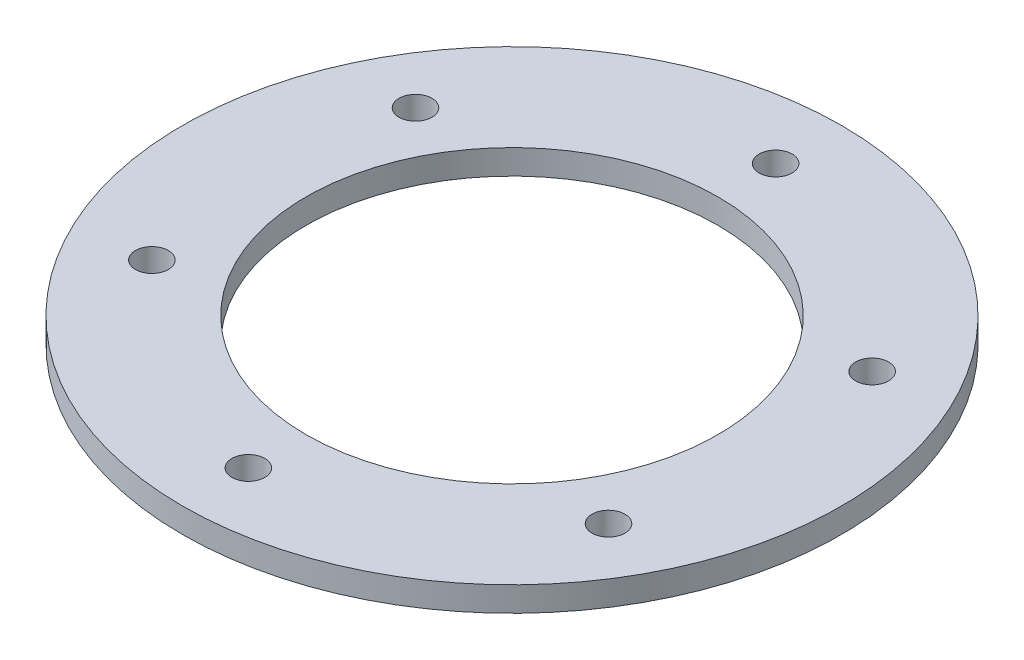
ISO-10303-21;
HEADER;
FILE_DESCRIPTION(('STEP AP214'),'2;1');
FILE_NAME('part.step','',(''),(''),'','','');
FILE_SCHEMA(('AUTOMOTIVE_DESIGN { 1 0 10303 214 1 1 1 1 }'));
ENDSEC;
DATA;
#1=APPLICATION_CONTEXT('core data for automotive mechanical design processes');
#2=APPLICATION_PROTOCOL_DEFINITION('international standard','automotive_design',2000,#1);
#3=PRODUCT_CONTEXT('',#1,'mechanical');
#4=PRODUCT('Part','Part','',(#3));
#5=PRODUCT_RELATED_PRODUCT_CATEGORY('part','',(#4));
#6=PRODUCT_DEFINITION_FORMATION('','',#4);
#7=PRODUCT_DEFINITION_CONTEXT('part definition',#1,'design');
#8=PRODUCT_DEFINITION('design','',#6,#7);
#9=PRODUCT_DEFINITION_SHAPE('','',#8);
#10=(LENGTH_UNIT() NAMED_UNIT(*) SI_UNIT(.MILLI.,.METRE.));
#11=(NAMED_UNIT(*) PLANE_ANGLE_UNIT() SI_UNIT($,.RADIAN.));
#12=(NAMED_UNIT(*) SI_UNIT($,.STERADIAN.) SOLID_ANGLE_UNIT());
#13=UNCERTAINTY_MEASURE_WITH_UNIT(LENGTH_MEASURE(1.E-05),#10,'distance_accuracy_value','');
#14=(GEOMETRIC_REPRESENTATION_CONTEXT(3) GLOBAL_UNCERTAINTY_ASSIGNED_CONTEXT((#13)) GLOBAL_UNIT_ASSIGNED_CONTEXT((#10,
#11,#12)) REPRESENTATION_CONTEXT('',''));
#15=CARTESIAN_POINT('',(0.,0.,0.));
#16=DIRECTION('',(0.,0.,1.));
#17=DIRECTION('',(1.,0.,0.));
#18=AXIS2_PLACEMENT_3D('',#15,#16,#17);
#19=CARTESIAN_POINT('',(0.,15.,0.));
#20=DIRECTION('',(0.,1.,0.));
#21=DIRECTION('',(0.,0.,1.));
#22=AXIS2_PLACEMENT_3D('',#19,#20,#21);
#23=PLANE('',#22);
#24=CARTESIAN_POINT('',(-138.56406460551,15.,80.0000000000001));
#25=DIRECTION('',(0.,1.,0.));
#26=DIRECTION('',(0.,0.,1.));
#27=AXIS2_PLACEMENT_3D('',#24,#25,#26);
#28=CIRCLE('',#27,10.);
#29=CARTESIAN_POINT('',(-138.56406460551,15.,90.0000000000001));
#30=VERTEX_POINT('',#29);
#31=EDGE_CURVE('E72',#30,#30,#28,.T.);
#32=ORIENTED_EDGE('',*,*,#31,.F.);
#33=EDGE_LOOP('',(#32));
#34=FACE_BOUND('',#33,.T.);
#35=CARTESIAN_POINT('',(138.56406460551,15.,80.));
#36=DIRECTION('',(0.,1.,0.));
#37=DIRECTION('',(0.,0.,1.));
#38=AXIS2_PLACEMENT_3D('',#35,#36,#37);
#39=CIRCLE('',#38,10.);
#40=CARTESIAN_POINT('',(138.56406460551,15.,90.));
#41=VERTEX_POINT('',#40);
#42=EDGE_CURVE('E60',#41,#41,#39,.T.);
#43=ORIENTED_EDGE('',*,*,#42,.F.);
#44=EDGE_LOOP('',(#43));
#45=FACE_BOUND('',#44,.T.);
#46=CARTESIAN_POINT('',(0.,15.,-160.));
#47=DIRECTION('',(0.,1.,0.));
#48=DIRECTION('',(0.,0.,1.));
#49=AXIS2_PLACEMENT_3D('',#46,#47,#48);
#50=CIRCLE('',#49,10.);
#51=CARTESIAN_POINT('',(0.,15.,-150.));
#52=VERTEX_POINT('',#51);
#53=EDGE_CURVE('E48',#52,#52,#50,.T.);
#54=ORIENTED_EDGE('',*,*,#53,.F.);
#55=EDGE_LOOP('',(#54));
#56=FACE_BOUND('',#55,.T.);
#57=CARTESIAN_POINT('',(0.,15.,0.));
#58=DIRECTION('',(0.,1.,0.));
#59=DIRECTION('',(0.,0.,1.));
#60=AXIS2_PLACEMENT_3D('',#57,#58,#59);
#61=CIRCLE('',#60,200.);
#62=CARTESIAN_POINT('',(0.,15.,200.));
#63=VERTEX_POINT('',#62);
#64=EDGE_CURVE('E10',#63,#63,#61,.T.);
#65=ORIENTED_EDGE('',*,*,#64,.T.);
#66=EDGE_LOOP('',(#65));
#67=FACE_BOUND('',#66,.T.);
#68=CARTESIAN_POINT('',(0.,15.,0.));
#69=DIRECTION('',(0.,1.,0.));
#70=DIRECTION('',(0.,0.,1.));
#71=AXIS2_PLACEMENT_3D('',#68,#69,#70);
#72=CIRCLE('',#71,125.);
#73=CARTESIAN_POINT('',(0.,15.,125.));
#74=VERTEX_POINT('',#73);
#75=EDGE_CURVE('E43',#74,#74,#72,.T.);
#76=ORIENTED_EDGE('',*,*,#75,.F.);
#77=EDGE_LOOP('',(#76));
#78=FACE_BOUND('',#77,.T.);
#79=CARTESIAN_POINT('',(138.56406460551,15.,-80.));
#80=DIRECTION('',(0.,1.,0.));
#81=DIRECTION('',(0.,0.,1.));
#82=AXIS2_PLACEMENT_3D('',#79,#80,#81);
#83=CIRCLE('',#82,10.);
#84=CARTESIAN_POINT('',(138.56406460551,15.,-70.));
#85=VERTEX_POINT('',#84);
#86=EDGE_CURVE('E54',#85,#85,#83,.T.);
#87=ORIENTED_EDGE('',*,*,#86,.F.);
#88=EDGE_LOOP('',(#87));
#89=FACE_BOUND('',#88,.T.);
#90=CARTESIAN_POINT('',(0.,15.,160.));
#91=DIRECTION('',(0.,1.,0.));
#92=DIRECTION('',(0.,0.,1.));
#93=AXIS2_PLACEMENT_3D('',#90,#91,#92);
#94=CIRCLE('',#93,10.);
#95=CARTESIAN_POINT('',(0.,15.,170.));
#96=VERTEX_POINT('',#95);
#97=EDGE_CURVE('E66',#96,#96,#94,.T.);
#98=ORIENTED_EDGE('',*,*,#97,.F.);
#99=EDGE_LOOP('',(#98));
#100=FACE_BOUND('',#99,.T.);
#101=CARTESIAN_POINT('',(-138.56406460551,15.,-79.9999999999999));
#102=DIRECTION('',(0.,1.,0.));
#103=DIRECTION('',(0.,0.,1.));
#104=AXIS2_PLACEMENT_3D('',#101,#102,#103);
#105=CIRCLE('',#104,10.);
#106=CARTESIAN_POINT('',(-138.56406460551,15.,-69.9999999999999));
#107=VERTEX_POINT('',#106);
#108=EDGE_CURVE('E78',#107,#107,#105,.T.);
#109=ORIENTED_EDGE('',*,*,#108,.F.);
#110=EDGE_LOOP('',(#109));
#111=FACE_BOUND('',#110,.T.);
#112=ADVANCED_FACE('F32',(#34,#45,#56,#67,#78,#89,#100,#111),#23,.T.);
#113=CARTESIAN_POINT('',(0.,0.,0.));
#114=DIRECTION('',(0.,1.,0.));
#115=DIRECTION('',(0.,0.,1.));
#116=AXIS2_PLACEMENT_3D('',#113,#114,#115);
#117=PLANE('',#116);
#118=CARTESIAN_POINT('',(0.,0.,0.));
#119=DIRECTION('',(0.,1.,0.));
#120=DIRECTION('',(0.,0.,1.));
#121=AXIS2_PLACEMENT_3D('',#118,#119,#120);
#122=CIRCLE('',#121,200.);
#123=CARTESIAN_POINT('',(0.,0.,200.));
#124=VERTEX_POINT('',#123);
#125=EDGE_CURVE('E36',#124,#124,#122,.T.);
#126=ORIENTED_EDGE('',*,*,#125,.F.);
#127=EDGE_LOOP('',(#126));
#128=FACE_BOUND('',#127,.T.);
#129=CARTESIAN_POINT('',(0.,0.,0.));
#130=DIRECTION('',(0.,1.,0.));
#131=DIRECTION('',(0.,0.,1.));
#132=AXIS2_PLACEMENT_3D('',#129,#130,#131);
#133=CIRCLE('',#132,125.);
#134=CARTESIAN_POINT('',(0.,0.,125.));
#135=VERTEX_POINT('',#134);
#136=EDGE_CURVE('E45',#135,#135,#133,.T.);
#137=ORIENTED_EDGE('',*,*,#136,.T.);
#138=EDGE_LOOP('',(#137));
#139=FACE_BOUND('',#138,.T.);
#140=CARTESIAN_POINT('',(0.,0.,-160.));
#141=DIRECTION('',(0.,1.,0.));
#142=DIRECTION('',(0.,0.,1.));
#143=AXIS2_PLACEMENT_3D('',#140,#141,#142);
#144=CIRCLE('',#143,10.);
#145=CARTESIAN_POINT('',(0.,0.,-150.));
#146=VERTEX_POINT('',#145);
#147=EDGE_CURVE('E51',#146,#146,#144,.T.);
#148=ORIENTED_EDGE('',*,*,#147,.T.);
#149=EDGE_LOOP('',(#148));
#150=FACE_BOUND('',#149,.T.);
#151=CARTESIAN_POINT('',(138.56406460551,0.,-80.));
#152=DIRECTION('',(0.,1.,0.));
#153=DIRECTION('',(0.,0.,1.));
#154=AXIS2_PLACEMENT_3D('',#151,#152,#153);
#155=CIRCLE('',#154,10.);
#156=CARTESIAN_POINT('',(138.56406460551,0.,-70.));
#157=VERTEX_POINT('',#156);
#158=EDGE_CURVE('E57',#157,#157,#155,.T.);
#159=ORIENTED_EDGE('',*,*,#158,.T.);
#160=EDGE_LOOP('',(#159));
#161=FACE_BOUND('',#160,.T.);
#162=CARTESIAN_POINT('',(138.56406460551,0.,80.));
#163=DIRECTION('',(0.,1.,0.));
#164=DIRECTION('',(0.,0.,1.));
#165=AXIS2_PLACEMENT_3D('',#162,#163,#164);
#166=CIRCLE('',#165,10.);
#167=CARTESIAN_POINT('',(138.56406460551,0.,90.));
#168=VERTEX_POINT('',#167);
#169=EDGE_CURVE('E63',#168,#168,#166,.T.);
#170=ORIENTED_EDGE('',*,*,#169,.T.);
#171=EDGE_LOOP('',(#170));
#172=FACE_BOUND('',#171,.T.);
#173=CARTESIAN_POINT('',(0.,0.,160.));
#174=DIRECTION('',(0.,1.,0.));
#175=DIRECTION('',(0.,0.,1.));
#176=AXIS2_PLACEMENT_3D('',#173,#174,#175);
#177=CIRCLE('',#176,10.);
#178=CARTESIAN_POINT('',(0.,0.,170.));
#179=VERTEX_POINT('',#178);
#180=EDGE_CURVE('E69',#179,#179,#177,.T.);
#181=ORIENTED_EDGE('',*,*,#180,.T.);
#182=EDGE_LOOP('',(#181));
#183=FACE_BOUND('',#182,.T.);
#184=CARTESIAN_POINT('',(-138.56406460551,0.,80.0000000000001));
#185=DIRECTION('',(0.,1.,0.));
#186=DIRECTION('',(0.,0.,1.));
#187=AXIS2_PLACEMENT_3D('',#184,#185,#186);
#188=CIRCLE('',#187,10.);
#189=CARTESIAN_POINT('',(-138.56406460551,0.,90.0000000000001));
#190=VERTEX_POINT('',#189);
#191=EDGE_CURVE('E75',#190,#190,#188,.T.);
#192=ORIENTED_EDGE('',*,*,#191,.T.);
#193=EDGE_LOOP('',(#192));
#194=FACE_BOUND('',#193,.T.);
#195=CARTESIAN_POINT('',(-138.56406460551,0.,-79.9999999999999));
#196=DIRECTION('',(0.,1.,0.));
#197=DIRECTION('',(0.,0.,1.));
#198=AXIS2_PLACEMENT_3D('',#195,#196,#197);
#199=CIRCLE('',#198,10.);
#200=CARTESIAN_POINT('',(-138.56406460551,0.,-69.9999999999999));
#201=VERTEX_POINT('',#200);
#202=EDGE_CURVE('E81',#201,#201,#199,.T.);
#203=ORIENTED_EDGE('',*,*,#202,.T.);
#204=EDGE_LOOP('',(#203));
#205=FACE_BOUND('',#204,.T.);
#206=ADVANCED_FACE('F91',(#128,#139,#150,#161,#172,#183,#194,#205),#117,.F.);
#207=CARTESIAN_POINT('',(0.,15.,0.));
#208=DIRECTION('',(0.,-1.,0.));
#209=DIRECTION('',(0.,0.,-1.));
#210=AXIS2_PLACEMENT_3D('',#207,#208,#209);
#211=CYLINDRICAL_SURFACE('',#210,200.);
#212=ORIENTED_EDGE('',*,*,#64,.F.);
#213=EDGE_LOOP('',(#212));
#214=FACE_BOUND('',#213,.T.);
#215=ORIENTED_EDGE('',*,*,#125,.T.);
#216=EDGE_LOOP('',(#215));
#217=FACE_BOUND('',#216,.T.);
#218=ADVANCED_FACE('F34',(#214,#217),#211,.T.);
#219=CARTESIAN_POINT('',(0.,15.,0.));
#220=DIRECTION('',(0.,-1.,0.));
#221=DIRECTION('',(0.,0.,-1.));
#222=AXIS2_PLACEMENT_3D('',#219,#220,#221);
#223=CYLINDRICAL_SURFACE('',#222,125.);
#224=ORIENTED_EDGE('',*,*,#75,.T.);
#225=EDGE_LOOP('',(#224));
#226=FACE_BOUND('',#225,.T.);
#227=ORIENTED_EDGE('',*,*,#136,.F.);
#228=EDGE_LOOP('',(#227));
#229=FACE_BOUND('',#228,.T.);
#230=ADVANCED_FACE('F101',(#226,#229),#223,.F.);
#231=CARTESIAN_POINT('',(0.,15.,-160.));
#232=DIRECTION('',(0.,-1.,0.));
#233=DIRECTION('',(0.,0.,-1.));
#234=AXIS2_PLACEMENT_3D('',#231,#232,#233);
#235=CYLINDRICAL_SURFACE('',#234,10.);
#236=ORIENTED_EDGE('',*,*,#53,.T.);
#237=EDGE_LOOP('',(#236));
#238=FACE_BOUND('',#237,.T.);
#239=ORIENTED_EDGE('',*,*,#147,.F.);
#240=EDGE_LOOP('',(#239));
#241=FACE_BOUND('',#240,.T.);
#242=ADVANCED_FACE('F104',(#238,#241),#235,.F.);
#243=CARTESIAN_POINT('',(138.56406460551,15.,-80.));
#244=DIRECTION('',(0.,-1.,0.));
#245=DIRECTION('',(0.,0.,-1.));
#246=AXIS2_PLACEMENT_3D('',#243,#244,#245);
#247=CYLINDRICAL_SURFACE('',#246,10.);
#248=ORIENTED_EDGE('',*,*,#86,.T.);
#249=EDGE_LOOP('',(#248));
#250=FACE_BOUND('',#249,.T.);
#251=ORIENTED_EDGE('',*,*,#158,.F.);
#252=EDGE_LOOP('',(#251));
#253=FACE_BOUND('',#252,.T.);
#254=ADVANCED_FACE('F108',(#250,#253),#247,.F.);
#255=CARTESIAN_POINT('',(138.56406460551,15.,80.));
#256=DIRECTION('',(0.,-1.,0.));
#257=DIRECTION('',(0.,0.,-1.));
#258=AXIS2_PLACEMENT_3D('',#255,#256,#257);
#259=CYLINDRICAL_SURFACE('',#258,10.);
#260=ORIENTED_EDGE('',*,*,#42,.T.);
#261=EDGE_LOOP('',(#260));
#262=FACE_BOUND('',#261,.T.);
#263=ORIENTED_EDGE('',*,*,#169,.F.);
#264=EDGE_LOOP('',(#263));
#265=FACE_BOUND('',#264,.T.);
#266=ADVANCED_FACE('F112',(#262,#265),#259,.F.);
#267=CARTESIAN_POINT('',(0.,15.,160.));
#268=DIRECTION('',(0.,-1.,0.));
#269=DIRECTION('',(0.,0.,-1.));
#270=AXIS2_PLACEMENT_3D('',#267,#268,#269);
#271=CYLINDRICAL_SURFACE('',#270,10.);
#272=ORIENTED_EDGE('',*,*,#97,.T.);
#273=EDGE_LOOP('',(#272));
#274=FACE_BOUND('',#273,.T.);
#275=ORIENTED_EDGE('',*,*,#180,.F.);
#276=EDGE_LOOP('',(#275));
#277=FACE_BOUND('',#276,.T.);
#278=ADVANCED_FACE('F116',(#274,#277),#271,.F.);
#279=CARTESIAN_POINT('',(-138.56406460551,15.,80.0000000000001));
#280=DIRECTION('',(0.,-1.,0.));
#281=DIRECTION('',(0.,0.,-1.));
#282=AXIS2_PLACEMENT_3D('',#279,#280,#281);
#283=CYLINDRICAL_SURFACE('',#282,10.);
#284=ORIENTED_EDGE('',*,*,#31,.T.);
#285=EDGE_LOOP('',(#284));
#286=FACE_BOUND('',#285,.T.);
#287=ORIENTED_EDGE('',*,*,#191,.F.);
#288=EDGE_LOOP('',(#287));
#289=FACE_BOUND('',#288,.T.);
#290=ADVANCED_FACE('F120',(#286,#289),#283,.F.);
#291=CARTESIAN_POINT('',(-138.56406460551,15.,-79.9999999999999));
#292=DIRECTION('',(0.,-1.,0.));
#293=DIRECTION('',(0.,0.,-1.));
#294=AXIS2_PLACEMENT_3D('',#291,#292,#293);
#295=CYLINDRICAL_SURFACE('',#294,10.);
#296=ORIENTED_EDGE('',*,*,#108,.T.);
#297=EDGE_LOOP('',(#296));
#298=FACE_BOUND('',#297,.T.);
#299=ORIENTED_EDGE('',*,*,#202,.F.);
#300=EDGE_LOOP('',(#299));
#301=FACE_BOUND('',#300,.T.);
#302=ADVANCED_FACE('F87',(#298,#301),#295,.F.);
#303=CLOSED_SHELL('',(#112,#206,#218,#230,#242,#254,#266,#278,#290,#302));
#304=MANIFOLD_SOLID_BREP('B2',#303);
#305=ADVANCED_BREP_SHAPE_REPRESENTATION('',(#18,#304),#14);
#306=SHAPE_DEFINITION_REPRESENTATION(#9,#305);
ENDSEC;
END-ISO-10303-21;
